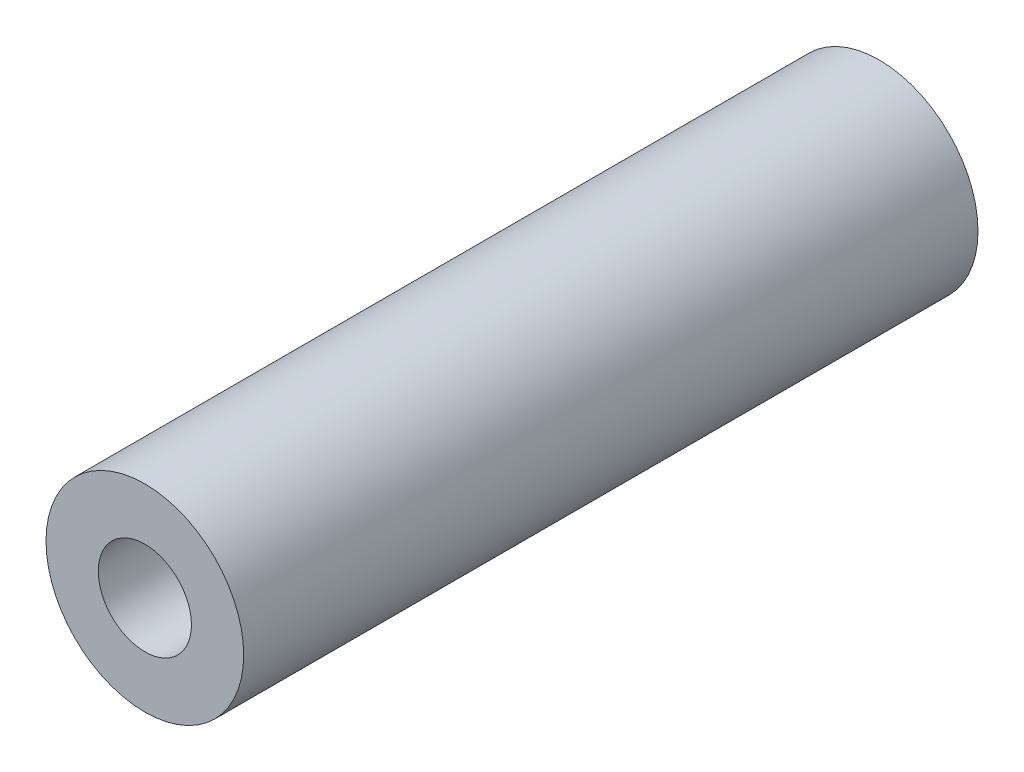
ISO-10303-21;
HEADER;
FILE_DESCRIPTION(('STEP AP214'),'2;1');
FILE_NAME('part.step','',(''),(''),'','','');
FILE_SCHEMA(('AUTOMOTIVE_DESIGN { 1 0 10303 214 1 1 1 1 }'));
ENDSEC;
DATA;
#1=APPLICATION_CONTEXT('core data for automotive mechanical design processes');
#2=APPLICATION_PROTOCOL_DEFINITION('international standard','automotive_design',2000,#1);
#3=PRODUCT_CONTEXT('',#1,'mechanical');
#4=PRODUCT('Part','Part','',(#3));
#5=PRODUCT_RELATED_PRODUCT_CATEGORY('part','',(#4));
#6=PRODUCT_DEFINITION_FORMATION('','',#4);
#7=PRODUCT_DEFINITION_CONTEXT('part definition',#1,'design');
#8=PRODUCT_DEFINITION('design','',#6,#7);
#9=PRODUCT_DEFINITION_SHAPE('','',#8);
#10=(LENGTH_UNIT() NAMED_UNIT(*) SI_UNIT(.MILLI.,.METRE.));
#11=(NAMED_UNIT(*) PLANE_ANGLE_UNIT() SI_UNIT($,.RADIAN.));
#12=(NAMED_UNIT(*) SI_UNIT($,.STERADIAN.) SOLID_ANGLE_UNIT());
#13=UNCERTAINTY_MEASURE_WITH_UNIT(LENGTH_MEASURE(1.E-05),#10,'distance_accuracy_value','');
#14=(GEOMETRIC_REPRESENTATION_CONTEXT(3) GLOBAL_UNCERTAINTY_ASSIGNED_CONTEXT((#13)) GLOBAL_UNIT_ASSIGNED_CONTEXT((#10,
#11,#12)) REPRESENTATION_CONTEXT('',''));
#15=CARTESIAN_POINT('',(0.,0.,0.));
#16=DIRECTION('',(0.,0.,1.));
#17=DIRECTION('',(1.,0.,0.));
#18=AXIS2_PLACEMENT_3D('',#15,#16,#17);
#19=CARTESIAN_POINT('',(0.,0.,52.));
#20=DIRECTION('',(0.,0.,1.));
#21=DIRECTION('',(1.,0.,0.));
#22=AXIS2_PLACEMENT_3D('',#19,#20,#21);
#23=PLANE('',#22);
#24=CARTESIAN_POINT('',(0.,0.,52.));
#25=DIRECTION('',(0.,0.,1.));
#26=DIRECTION('',(1.,0.,0.));
#27=AXIS2_PLACEMENT_3D('',#24,#25,#26);
#28=CIRCLE('',#27,7.);
#29=CARTESIAN_POINT('',(7.,0.,52.));
#30=VERTEX_POINT('',#29);
#31=EDGE_CURVE('E10',#30,#30,#28,.T.);
#32=ORIENTED_EDGE('',*,*,#31,.T.);
#33=EDGE_LOOP('',(#32));
#34=FACE_BOUND('',#33,.T.);
#35=CARTESIAN_POINT('',(0.,0.,52.));
#36=DIRECTION('',(0.,0.,1.));
#37=DIRECTION('',(1.,0.,0.));
#38=AXIS2_PLACEMENT_3D('',#35,#36,#37);
#39=CIRCLE('',#38,3.3);
#40=CARTESIAN_POINT('',(3.3,0.,52.));
#41=VERTEX_POINT('',#40);
#42=EDGE_CURVE('E48',#41,#41,#39,.T.);
#43=ORIENTED_EDGE('',*,*,#42,.F.);
#44=EDGE_LOOP('',(#43));
#45=FACE_BOUND('',#44,.T.);
#46=ADVANCED_FACE('F40',(#34,#45),#23,.T.);
#47=CARTESIAN_POINT('',(0.,0.,0.));
#48=DIRECTION('',(0.,0.,1.));
#49=DIRECTION('',(1.,0.,0.));
#50=AXIS2_PLACEMENT_3D('',#47,#48,#49);
#51=PLANE('',#50);
#52=CARTESIAN_POINT('',(0.,0.,0.));
#53=DIRECTION('',(0.,0.,1.));
#54=DIRECTION('',(1.,0.,0.));
#55=AXIS2_PLACEMENT_3D('',#52,#53,#54);
#56=CIRCLE('',#55,7.);
#57=CARTESIAN_POINT('',(7.,0.,0.));
#58=VERTEX_POINT('',#57);
#59=EDGE_CURVE('E41',#58,#58,#56,.T.);
#60=ORIENTED_EDGE('',*,*,#59,.F.);
#61=EDGE_LOOP('',(#60));
#62=FACE_BOUND('',#61,.T.);
#63=CARTESIAN_POINT('',(0.,0.,0.));
#64=DIRECTION('',(0.,0.,1.));
#65=DIRECTION('',(1.,0.,0.));
#66=AXIS2_PLACEMENT_3D('',#63,#64,#65);
#67=CIRCLE('',#66,3.3);
#68=CARTESIAN_POINT('',(3.3,0.,0.));
#69=VERTEX_POINT('',#68);
#70=EDGE_CURVE('E49',#69,#69,#67,.T.);
#71=ORIENTED_EDGE('',*,*,#70,.T.);
#72=EDGE_LOOP('',(#71));
#73=FACE_BOUND('',#72,.T.);
#74=ADVANCED_FACE('F58',(#62,#73),#51,.F.);
#75=CARTESIAN_POINT('',(0.,0.,52.));
#76=DIRECTION('',(0.,0.,-1.));
#77=DIRECTION('',(-1.,0.,0.));
#78=AXIS2_PLACEMENT_3D('',#75,#76,#77);
#79=CYLINDRICAL_SURFACE('',#78,7.);
#80=ORIENTED_EDGE('',*,*,#31,.F.);
#81=EDGE_LOOP('',(#80));
#82=FACE_BOUND('',#81,.T.);
#83=ORIENTED_EDGE('',*,*,#59,.T.);
#84=EDGE_LOOP('',(#83));
#85=FACE_BOUND('',#84,.T.);
#86=ADVANCED_FACE('F39',(#82,#85),#79,.T.);
#87=CARTESIAN_POINT('',(0.,0.,52.));
#88=DIRECTION('',(0.,0.,-1.));
#89=DIRECTION('',(-1.,0.,0.));
#90=AXIS2_PLACEMENT_3D('',#87,#88,#89);
#91=CYLINDRICAL_SURFACE('',#90,3.3);
#92=ORIENTED_EDGE('',*,*,#42,.T.);
#93=EDGE_LOOP('',(#92));
#94=FACE_BOUND('',#93,.T.);
#95=ORIENTED_EDGE('',*,*,#70,.F.);
#96=EDGE_LOOP('',(#95));
#97=FACE_BOUND('',#96,.T.);
#98=ADVANCED_FACE('F57',(#94,#97),#91,.F.);
#99=CLOSED_SHELL('',(#46,#74,#86,#98));
#100=MANIFOLD_SOLID_BREP('B2',#99);
#101=ADVANCED_BREP_SHAPE_REPRESENTATION('',(#18,#100),#14);
#102=SHAPE_DEFINITION_REPRESENTATION(#9,#101);
ENDSEC;
END-ISO-10303-21;
